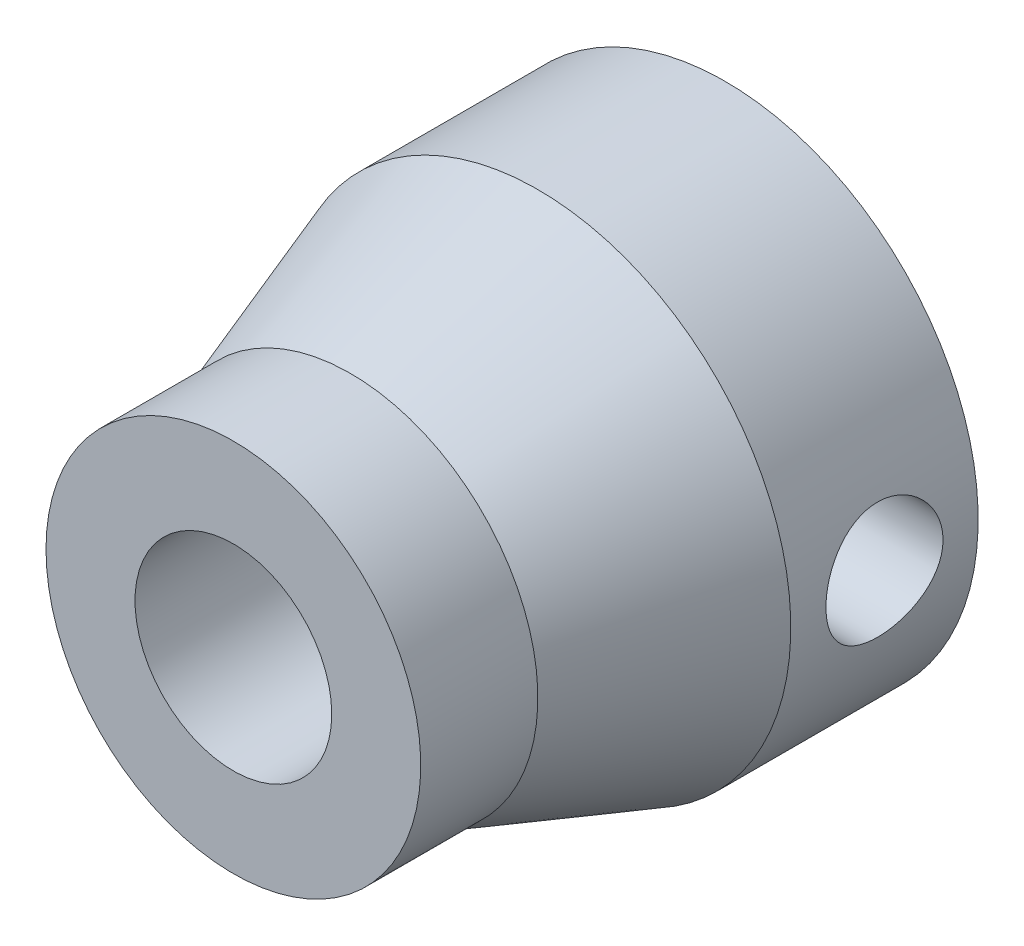
ISO-10303-21;
HEADER;
FILE_DESCRIPTION(('STEP AP214'),'2;1');
FILE_NAME('part.step','',(''),(''),'','','');
FILE_SCHEMA(('AUTOMOTIVE_DESIGN { 1 0 10303 214 1 1 1 1 }'));
ENDSEC;
DATA;
#1=APPLICATION_CONTEXT('core data for automotive mechanical design processes');
#2=APPLICATION_PROTOCOL_DEFINITION('international standard','automotive_design',2000,#1);
#3=PRODUCT_CONTEXT('',#1,'mechanical');
#4=PRODUCT('Part','Part','',(#3));
#5=PRODUCT_RELATED_PRODUCT_CATEGORY('part','',(#4));
#6=PRODUCT_DEFINITION_FORMATION('','',#4);
#7=PRODUCT_DEFINITION_CONTEXT('part definition',#1,'design');
#8=PRODUCT_DEFINITION('design','',#6,#7);
#9=PRODUCT_DEFINITION_SHAPE('','',#8);
#10=(LENGTH_UNIT() NAMED_UNIT(*) SI_UNIT(.MILLI.,.METRE.));
#11=(NAMED_UNIT(*) PLANE_ANGLE_UNIT() SI_UNIT($,.RADIAN.));
#12=(NAMED_UNIT(*) SI_UNIT($,.STERADIAN.) SOLID_ANGLE_UNIT());
#13=UNCERTAINTY_MEASURE_WITH_UNIT(LENGTH_MEASURE(1.E-05),#10,'distance_accuracy_value','');
#14=(GEOMETRIC_REPRESENTATION_CONTEXT(3) GLOBAL_UNCERTAINTY_ASSIGNED_CONTEXT((#13)) GLOBAL_UNIT_ASSIGNED_CONTEXT((#10,
#11,#12)) REPRESENTATION_CONTEXT('',''));
#15=CARTESIAN_POINT('',(0.,0.,0.));
#16=DIRECTION('',(0.,0.,1.));
#17=DIRECTION('',(1.,0.,0.));
#18=AXIS2_PLACEMENT_3D('',#15,#16,#17);
#19=CARTESIAN_POINT('',(0.,0.,0.));
#20=DIRECTION('',(0.,0.,-1.));
#21=DIRECTION('',(-1.,0.,0.));
#22=AXIS2_PLACEMENT_3D('',#19,#20,#21);
#23=CYLINDRICAL_SURFACE('',#22,2.5);
#24=CARTESIAN_POINT('',(2.5,0.,0.750000000000001));
#25=CARTESIAN_POINT('',(2.49999641755189,-0.065714953691233,0.750004127899377));
#26=CARTESIAN_POINT('',(2.49738113774397,-0.13150824962254,0.755212591402095));
#27=CARTESIAN_POINT('',(2.48717695046745,-0.261150294085531,0.775816100426148));
#28=CARTESIAN_POINT('',(2.47957859786229,-0.324995108391879,0.791230491247063));
#29=CARTESIAN_POINT('',(2.4602034925414,-0.448666931100717,0.831492260770994));
#30=CARTESIAN_POINT('',(2.448442989719,-0.508508503673974,0.856302980310016));
#31=CARTESIAN_POINT('',(2.42182220644723,-0.623090771008206,0.914463276706177));
#32=CARTESIAN_POINT('',(2.40696217041913,-0.677831867487562,0.947812180311066));
#33=CARTESIAN_POINT('',(2.37445322822571,-0.784384772202398,1.02439656185662));
#34=CARTESIAN_POINT('',(2.3566899890942,-0.835819013902639,1.06810809904955));
#35=CARTESIAN_POINT('',(2.32074962808431,-0.930974306083721,1.16315184905879));
#36=CARTESIAN_POINT('',(2.30257220261294,-0.974689478883457,1.21448981471555));
#37=CARTESIAN_POINT('',(2.26623688996684,-1.05656500056285,1.32810418690423));
#38=CARTESIAN_POINT('',(2.24818983712665,-1.09403166943955,1.39092012293239));
#39=CARTESIAN_POINT('',(2.21607473465401,-1.15771028361337,1.52295916998277));
#40=CARTESIAN_POINT('',(2.20200384508737,-1.18393026870792,1.59217766090344));
#41=CARTESIAN_POINT('',(2.18072333797261,-1.22266555273573,1.7308313817774));
#42=CARTESIAN_POINT('',(2.17315339479642,-1.23590732135055,1.80000556508424));
#43=CARTESIAN_POINT('',(2.1647736243566,-1.25053374163606,1.93997354722435));
#44=CARTESIAN_POINT('',(2.1639571167911,-1.25193011046634,2.01076567608894));
#45=CARTESIAN_POINT('',(2.16888662821561,-1.24335910896537,2.14285753039421));
#46=CARTESIAN_POINT('',(2.17385954577517,-1.23473069942103,2.20428003902881));
#47=CARTESIAN_POINT('',(2.18845285917313,-1.20867481132116,2.3246523867163));
#48=CARTESIAN_POINT('',(2.1980747353972,-1.19124452987206,2.38360143163164));
#49=CARTESIAN_POINT('',(2.22109345515926,-1.1477622254825,2.49903641570707));
#50=CARTESIAN_POINT('',(2.23457300829998,-1.12151883389499,2.55543299848224));
#51=CARTESIAN_POINT('',(2.26379255351755,-1.061302109585,2.66329286573751));
#52=CARTESIAN_POINT('',(2.27953355975238,-1.02732530476558,2.71475391950011));
#53=CARTESIAN_POINT('',(2.31391447379107,-0.947582568640985,2.81815156592903));
#54=CARTESIAN_POINT('',(2.33266887795933,-0.900868072961601,2.8693210919702));
#55=CARTESIAN_POINT('',(2.36934529125509,-0.799444473426716,2.96341927323863));
#56=CARTESIAN_POINT('',(2.38726689948501,-0.744731570717856,3.00634399004235));
#57=CARTESIAN_POINT('',(2.42127484103705,-0.62564563228981,3.08460707628716));
#58=CARTESIAN_POINT('',(2.43723730202509,-0.56094198949926,3.11950059055717));
#59=CARTESIAN_POINT('',(2.46447351401553,-0.425582769360996,3.17762128630376));
#60=CARTESIAN_POINT('',(2.47575098679441,-0.354931970331595,3.20085773126896));
#61=CARTESIAN_POINT('',(2.49155417176795,-0.215958114575877,3.23309425464584));
#62=CARTESIAN_POINT('',(2.4965617287664,-0.147926913185405,3.24311404468347));
#63=CARTESIAN_POINT('',(2.50091266823877,-0.0109744999366918,3.25183091391811));
#64=CARTESIAN_POINT('',(2.5002587340164,0.0579462748373768,3.25053335704935));
#65=CARTESIAN_POINT('',(2.49363990316801,0.189041214982492,3.23724163947656));
#66=CARTESIAN_POINT('',(2.48809057110237,0.251324260062443,3.22608433408746));
#67=CARTESIAN_POINT('',(2.47277714143524,0.373008615377396,3.19470241013114));
#68=CARTESIAN_POINT('',(2.46301257917916,0.432409607113746,3.1744767919333));
#69=CARTESIAN_POINT('',(2.43980314267087,0.548610760562081,3.12500191695853));
#70=CARTESIAN_POINT('',(2.42626102212424,0.605287996257691,3.09551118735398));
#71=CARTESIAN_POINT('',(2.39679967896386,0.71307670212365,3.02861558044245));
#72=CARTESIAN_POINT('',(2.38087944457231,0.764185787219102,2.99120733175821));
#73=CARTESIAN_POINT('',(2.34635276671831,0.864709611613316,2.90529946833391));
#74=CARTESIAN_POINT('',(2.32763606060552,0.913465097280798,2.85607141443304));
#75=CARTESIAN_POINT('',(2.29077989504843,1.00232040139155,2.75009356091337));
#76=CARTESIAN_POINT('',(2.27264084226908,1.04241423211355,2.69333860147953));
#77=CARTESIAN_POINT('',(2.23813990282585,1.11463489312212,2.57044543224961));
#78=CARTESIAN_POINT('',(2.2219066207934,1.1462818698483,2.50398591723926));
#79=CARTESIAN_POINT('',(2.19467590460158,1.19760353251725,2.36561241538435));
#80=CARTESIAN_POINT('',(2.18367172800773,1.21729364485946,2.29370559187352));
#81=CARTESIAN_POINT('',(2.16951876260834,1.2423271093121,2.15386222142319));
#82=CARTESIAN_POINT('',(2.16571729325614,1.24886624550108,2.0862071832137));
#83=CARTESIAN_POINT('',(2.16456693307719,1.25086144297598,1.95069116603659));
#84=CARTESIAN_POINT('',(2.16721524534441,1.2463223082805,1.88283028907571));
#85=CARTESIAN_POINT('',(2.17797327562531,1.22740765699033,1.75564562308498));
#86=CARTESIAN_POINT('',(2.18553868102992,1.2140103929285,1.6961244123195));
#87=CARTESIAN_POINT('',(2.20463770234897,1.17896919778081,1.58023985071912));
#88=CARTESIAN_POINT('',(2.21617259462095,1.15732261394976,1.52387752238504));
#89=CARTESIAN_POINT('',(2.2428566295566,1.10476968162585,1.41171893626674));
#90=CARTESIAN_POINT('',(2.25819652995238,1.07333892227057,1.35621512271287));
#91=CARTESIAN_POINT('',(2.29044164543238,1.00268871454579,1.25090682977427));
#92=CARTESIAN_POINT('',(2.30734767243153,0.963465214048309,1.20110533685189));
#93=CARTESIAN_POINT('',(2.34327903949141,0.8727541583308,1.10232252205298));
#94=CARTESIAN_POINT('',(2.36231229139336,0.820355528762713,1.0541761220476));
#95=CARTESIAN_POINT('',(2.3984719031886,0.707693507775348,0.96717127072046));
#96=CARTESIAN_POINT('',(2.4155972326005,0.64742590407098,0.928317825717139));
#97=CARTESIAN_POINT('',(2.44622511981379,0.519914496024932,0.860954546547245));
#98=CARTESIAN_POINT('',(2.45970120703636,0.452624379918267,0.832519788235707));
#99=CARTESIAN_POINT('',(2.48126676704332,0.313427626617738,0.787739790101311));
#100=CARTESIAN_POINT('',(2.48937154216165,0.241534749528956,0.771360191463029));
#101=CARTESIAN_POINT('',(2.49619327387079,0.140752433104229,0.757628236155189));
#102=CARTESIAN_POINT('',(2.49761706674002,0.112702349299373,0.754771698920477));
#103=CARTESIAN_POINT('',(2.49952121222331,0.0564396647589471,0.750956668103994));
#104=CARTESIAN_POINT('',(2.50000153879704,0.0282270595592268,0.749998226911001));
#105=CARTESIAN_POINT('',(2.5,0.,0.750000000000001));
#106=B_SPLINE_CURVE_WITH_KNOTS('',3,(#24,#25,#26,#27,#28,#29,#30,#31,#32,#33,#34,#35,#36,#37,
#38,#39,#40,#41,#42,#43,#44,#45,#46,#47,#48,#49,#50,#51,#52,#53,#54,#55,#56,#57,#58,#59,#60,#61,
#62,#63,#64,#65,#66,#67,#68,#69,#70,#71,#72,#73,#74,#75,#76,#77,#78,#79,#80,#81,#82,#83,#84,#85,
#86,#87,#88,#89,#90,#91,#92,#93,#94,#95,#96,#97,#98,#99,#100,#101,#102,#103,#104,#105),
.UNSPECIFIED.,.T.,.F.,(4,2,2,2,2,2,2,2,2,2,2,2,2,2,2,2,2,2,2,2,2,2,2,2,2,2,2,2,2,2,2,2,2,2,2,2,
2,2,2,2,4),(0.,0.197030321775365,0.394435187136497,0.591077694365372,0.787704700726959,
0.99622719839761,1.20490779706754,1.42977158038441,1.65447434872851,1.86572515175287,
2.07676696661275,2.26257140511651,2.44843504907098,2.63862800210609,2.82890651575277,
3.04331176667348,3.25781918248358,3.4822877776805,3.70657771140349,3.91229113089182,
4.11790705639345,4.30758633132652,4.49728652038664,4.69241070034873,4.88761813435423,
5.10199513305523,5.31651985769289,5.54143352699592,5.76605639925971,5.96911634372966,
6.17208824825006,6.35572412805228,6.53941910979597,6.73545570969517,6.93159451423696,
7.15156553440622,7.37165479220715,7.59330017078656,7.81431135781162,7.89894100172121,
7.98357298143558),.UNSPECIFIED.);
#107=CARTESIAN_POINT('',(2.5,0.,0.750000000000001));
#108=VERTEX_POINT('',#107);
#109=EDGE_CURVE('E74',#108,#108,#106,.T.);
#110=ORIENTED_EDGE('',*,*,#109,.F.);
#111=EDGE_LOOP('',(#110));
#112=FACE_BOUND('',#111,.T.);
#113=CARTESIAN_POINT('',(0.,0.,0.));
#114=DIRECTION('',(0.,0.,-1.));
#115=DIRECTION('',(-1.,0.,0.));
#116=AXIS2_PLACEMENT_3D('',#113,#114,#115);
#117=CIRCLE('',#116,2.5);
#118=CARTESIAN_POINT('',(-2.5,0.,0.));
#119=VERTEX_POINT('',#118);
#120=EDGE_CURVE('E57',#119,#119,#117,.T.);
#121=ORIENTED_EDGE('',*,*,#120,.T.);
#122=EDGE_LOOP('',(#121));
#123=FACE_BOUND('',#122,.T.);
#124=CARTESIAN_POINT('',(0.,0.,5.));
#125=DIRECTION('',(0.,0.,-1.));
#126=DIRECTION('',(-1.,0.,0.));
#127=AXIS2_PLACEMENT_3D('',#124,#125,#126);
#128=CIRCLE('',#127,2.5);
#129=CARTESIAN_POINT('',(-2.5,0.,5.));
#130=VERTEX_POINT('',#129);
#131=EDGE_CURVE('E10',#130,#130,#128,.T.);
#132=ORIENTED_EDGE('',*,*,#131,.F.);
#133=EDGE_LOOP('',(#132));
#134=FACE_BOUND('',#133,.T.);
#135=ADVANCED_FACE('F35',(#112,#123,#134),#23,.F.);
#136=CARTESIAN_POINT('',(-1.,0.,5.));
#137=DIRECTION('',(0.,0.,-1.));
#138=DIRECTION('',(-1.,0.,0.));
#139=AXIS2_PLACEMENT_3D('',#136,#137,#138);
#140=PLANE('',#139);
#141=CARTESIAN_POINT('',(0.,0.,5.));
#142=DIRECTION('',(0.,0.,-1.));
#143=DIRECTION('',(-1.,0.,0.));
#144=AXIS2_PLACEMENT_3D('',#141,#142,#143);
#145=CIRCLE('',#144,2.09999999999999);
#146=CARTESIAN_POINT('',(-2.09999999999999,0.,5.));
#147=VERTEX_POINT('',#146);
#148=EDGE_CURVE('E60',#147,#147,#145,.T.);
#149=ORIENTED_EDGE('',*,*,#148,.F.);
#150=EDGE_LOOP('',(#149));
#151=FACE_BOUND('',#150,.T.);
#152=ORIENTED_EDGE('',*,*,#131,.T.);
#153=EDGE_LOOP('',(#152));
#154=FACE_BOUND('',#153,.T.);
#155=ADVANCED_FACE('F103',(#151,#154),#140,.T.);
#156=CARTESIAN_POINT('',(-1.,0.,10.5));
#157=DIRECTION('',(0.,0.,1.));
#158=DIRECTION('',(1.,0.,0.));
#159=AXIS2_PLACEMENT_3D('',#156,#157,#158);
#160=PLANE('',#159);
#161=CARTESIAN_POINT('',(0.,0.,10.5));
#162=DIRECTION('',(0.,0.,1.));
#163=DIRECTION('',(1.,0.,0.));
#164=AXIS2_PLACEMENT_3D('',#161,#162,#163);
#165=CIRCLE('',#164,2.09999999999999);
#166=CARTESIAN_POINT('',(2.09999999999999,0.,10.5));
#167=VERTEX_POINT('',#166);
#168=EDGE_CURVE('E63',#167,#167,#165,.T.);
#169=ORIENTED_EDGE('',*,*,#168,.F.);
#170=EDGE_LOOP('',(#169));
#171=FACE_BOUND('',#170,.T.);
#172=CARTESIAN_POINT('',(0.,0.,10.5));
#173=DIRECTION('',(0.,0.,-1.));
#174=DIRECTION('',(-1.,0.,0.));
#175=AXIS2_PLACEMENT_3D('',#172,#173,#174);
#176=CIRCLE('',#175,4.);
#177=CARTESIAN_POINT('',(-4.,0.,10.5));
#178=VERTEX_POINT('',#177);
#179=EDGE_CURVE('E41',#178,#178,#176,.T.);
#180=ORIENTED_EDGE('',*,*,#179,.F.);
#181=EDGE_LOOP('',(#180));
#182=FACE_BOUND('',#181,.T.);
#183=ADVANCED_FACE('F108',(#171,#182),#160,.T.);
#184=CARTESIAN_POINT('',(0.,0.,0.));
#185=DIRECTION('',(0.,0.,-1.));
#186=DIRECTION('',(-1.,0.,0.));
#187=AXIS2_PLACEMENT_3D('',#184,#185,#186);
#188=CYLINDRICAL_SURFACE('',#187,4.);
#189=ORIENTED_EDGE('',*,*,#179,.T.);
#190=EDGE_LOOP('',(#189));
#191=FACE_BOUND('',#190,.T.);
#192=CARTESIAN_POINT('',(0.,0.,8.));
#193=DIRECTION('',(0.,0.,-1.));
#194=DIRECTION('',(-1.,0.,0.));
#195=AXIS2_PLACEMENT_3D('',#192,#193,#194);
#196=CIRCLE('',#195,4.);
#197=CARTESIAN_POINT('',(-4.,0.,8.));
#198=VERTEX_POINT('',#197);
#199=EDGE_CURVE('E45',#198,#198,#196,.T.);
#200=ORIENTED_EDGE('',*,*,#199,.F.);
#201=EDGE_LOOP('',(#200));
#202=FACE_BOUND('',#201,.T.);
#203=ADVANCED_FACE('F119',(#191,#202),#188,.T.);
#204=CARTESIAN_POINT('',(0.,0.,4.));
#205=DIRECTION('',(0.,0.,-1.));
#206=DIRECTION('',(-1.,0.,0.));
#207=AXIS2_PLACEMENT_3D('',#204,#205,#206);
#208=CONICAL_SURFACE('',#207,5.4,0.336674819386727);
#209=ORIENTED_EDGE('',*,*,#199,.T.);
#210=EDGE_LOOP('',(#209));
#211=FACE_BOUND('',#210,.T.);
#212=CARTESIAN_POINT('',(0.,0.,4.));
#213=DIRECTION('',(0.,0.,-1.));
#214=DIRECTION('',(-1.,0.,0.));
#215=AXIS2_PLACEMENT_3D('',#212,#213,#214);
#216=CIRCLE('',#215,5.4);
#217=CARTESIAN_POINT('',(-5.4,0.,4.));
#218=VERTEX_POINT('',#217);
#219=EDGE_CURVE('E49',#218,#218,#216,.T.);
#220=ORIENTED_EDGE('',*,*,#219,.F.);
#221=EDGE_LOOP('',(#220));
#222=FACE_BOUND('',#221,.T.);
#223=ADVANCED_FACE('F99',(#211,#222),#208,.T.);
#224=CARTESIAN_POINT('',(0.,0.,0.));
#225=DIRECTION('',(0.,0.,-1.));
#226=DIRECTION('',(-1.,0.,0.));
#227=AXIS2_PLACEMENT_3D('',#224,#225,#226);
#228=CYLINDRICAL_SURFACE('',#227,5.4);
#229=CARTESIAN_POINT('',(5.4,0.,0.750000000000001));
#230=CARTESIAN_POINT('',(5.39999874823438,0.0692241871145403,0.750002211770963));
#231=CARTESIAN_POINT('',(5.39865546800572,0.138474266427772,0.755769777927965));
#232=CARTESIAN_POINT('',(5.39342675426803,0.275000425366631,0.778659560700592));
#233=CARTESIAN_POINT('',(5.38953965210246,0.342275178961732,0.795789230551391));
#234=CARTESIAN_POINT('',(5.37965516979212,0.472858483968851,0.840832442091347));
#235=CARTESIAN_POINT('',(5.37366012568423,0.536171334869416,0.868734049579805));
#236=CARTESIAN_POINT('',(5.36020341061013,0.657216106152046,0.934489581370946));
#237=CARTESIAN_POINT('',(5.35274174258654,0.714948037731248,0.97234348570552));
#238=CARTESIAN_POINT('',(5.33701743019704,0.824223728513662,1.0576434492428));
#239=CARTESIAN_POINT('',(5.32874387739558,0.875653654684864,1.1052333370637));
#240=CARTESIAN_POINT('',(5.31240337894845,0.969877453577131,1.20834591811521));
#241=CARTESIAN_POINT('',(5.30433645361578,1.01267048005084,1.26386938777234));
#242=CARTESIAN_POINT('',(5.2892141261743,1.08892093571322,1.38213125549625));
#243=CARTESIAN_POINT('',(5.28217265376136,1.12225476741282,1.44495128561076));
#244=CARTESIAN_POINT('',(5.27005610560817,1.17784701650963,1.57549178185647));
#245=CARTESIAN_POINT('',(5.26498076415844,1.20010693058863,1.64321158434705));
#246=CARTESIAN_POINT('',(5.25748265119255,1.23253847327747,1.78038763342959));
#247=CARTESIAN_POINT('',(5.2550154349981,1.24291290618177,1.84979344937481));
#248=CARTESIAN_POINT('',(5.25287961956346,1.25191004217409,1.98940090166641));
#249=CARTESIAN_POINT('',(5.25321063325227,1.25053437061961,2.05960242660308));
#250=CARTESIAN_POINT('',(5.25659375047557,1.23623300176578,2.19728284421562));
#251=CARTESIAN_POINT('',(5.25958979574762,1.22354523877694,2.26478804070032));
#252=CARTESIAN_POINT('',(5.2678764915052,1.18735782432143,2.39668487670125));
#253=CARTESIAN_POINT('',(5.2731672844797,1.16385750145935,2.46107632259772));
#254=CARTESIAN_POINT('',(5.28550107960884,1.10649981926167,2.58557453093805));
#255=CARTESIAN_POINT('',(5.29255911403959,1.07255300269372,2.64563852802482));
#256=CARTESIAN_POINT('',(5.30762320463089,0.995328718186158,2.75930459854825));
#257=CARTESIAN_POINT('',(5.31562940449809,0.952049835034112,2.81290568995769));
#258=CARTESIAN_POINT('',(5.33192650722274,0.856141032424575,2.9134918693618));
#259=CARTESIAN_POINT('',(5.34021959983535,0.803309372870152,2.96028445401572));
#260=CARTESIAN_POINT('',(5.35597952063802,0.690452447512654,3.04437901499062));
#261=CARTESIAN_POINT('',(5.36344633016309,0.630427019272688,3.08168077694731));
#262=CARTESIAN_POINT('',(5.37674137922928,0.504635960206347,3.14579134647603));
#263=CARTESIAN_POINT('',(5.38256529931455,0.438855782479791,3.17257256478928));
#264=CARTESIAN_POINT('',(5.39188660170977,0.30356339515595,3.21464627002836));
#265=CARTESIAN_POINT('',(5.39538436395879,0.234051797029329,3.22994063319308));
#266=CARTESIAN_POINT('',(5.39960432194415,0.0949188474226058,3.24832100682319));
#267=CARTESIAN_POINT('',(5.40038621683971,0.0253339536305773,3.25166964888367));
#268=CARTESIAN_POINT('',(5.39925471054082,-0.113401199396407,3.24677870165908));
#269=CARTESIAN_POINT('',(5.39734151538226,-0.182551491450131,3.23853999821056));
#270=CARTESIAN_POINT('',(5.39107270805315,-0.317567653128891,3.21092556690345));
#271=CARTESIAN_POINT('',(5.38674779900457,-0.383463694391253,3.19168976509555));
#272=CARTESIAN_POINT('',(5.37614070405043,-0.511092660604726,3.14278425017143));
#273=CARTESIAN_POINT('',(5.3698583382899,-0.572825202371076,3.11311357824669));
#274=CARTESIAN_POINT('',(5.35588743525236,-0.691444779334462,3.04364847732382));
#275=CARTESIAN_POINT('',(5.34817839030347,-0.748240639647342,3.00370257610649));
#276=CARTESIAN_POINT('',(5.33224710804932,-0.854416896018498,2.91501804549652));
#277=CARTESIAN_POINT('',(5.32402479563046,-0.903796203090457,2.86627812717025));
#278=CARTESIAN_POINT('',(5.30778399091491,-0.994793544081783,2.76017783658924));
#279=CARTESIAN_POINT('',(5.29977329933032,-1.0362287089936,2.70265919800381));
#280=CARTESIAN_POINT('',(5.28505640511214,-1.10885407052095,2.58132673225702));
#281=CARTESIAN_POINT('',(5.27835014441881,-1.14004472315851,2.51751318547033));
#282=CARTESIAN_POINT('',(5.26706995749014,-1.19107407331668,2.38575053162684));
#283=CARTESIAN_POINT('',(5.2624836492151,-1.21097884732069,2.31782812839382));
#284=CARTESIAN_POINT('',(5.2559438279697,-1.23905858603521,2.17948120782013));
#285=CARTESIAN_POINT('',(5.25398983488665,-1.24723568979417,2.10905714916654));
#286=CARTESIAN_POINT('',(5.25296867632895,-1.2515285845306,1.96955615019909));
#287=CARTESIAN_POINT('',(5.25383190937952,-1.24793516606778,1.9004885130342));
#288=CARTESIAN_POINT('',(5.25818914739366,-1.22944516739717,1.76397209528447));
#289=CARTESIAN_POINT('',(5.26168311330701,-1.21454875496928,1.69652329068526));
#290=CARTESIAN_POINT('',(5.27087224339566,-1.17402355997323,1.56542361089538));
#291=CARTESIAN_POINT('',(5.27655773123556,-1.14844191549021,1.50175744065481));
#292=CARTESIAN_POINT('',(5.28949203841655,-1.08731126166201,1.37957919121915));
#293=CARTESIAN_POINT('',(5.2967410425912,-1.05176107372034,1.32106772254817));
#294=CARTESIAN_POINT('',(5.31218981239259,-0.970758826498259,1.20943725861768));
#295=CARTESIAN_POINT('',(5.32040732565605,-0.92510163582206,1.15646954095245));
#296=CARTESIAN_POINT('',(5.33675342745657,-0.825590992830997,1.05885252724268));
#297=CARTESIAN_POINT('',(5.34488199482159,-0.771735632696653,1.01420517284684));
#298=CARTESIAN_POINT('',(5.36027855985255,-0.656388355565246,0.933853560611235));
#299=CARTESIAN_POINT('',(5.36753191208641,-0.594794510125286,0.898292637731052));
#300=CARTESIAN_POINT('',(5.38021121124879,-0.466345339684815,0.838085876748606));
#301=CARTESIAN_POINT('',(5.3856386038694,-0.399494229079049,0.813431398643538));
#302=CARTESIAN_POINT('',(5.39315038381651,-0.277203903682884,0.779846767779616));
#303=CARTESIAN_POINT('',(5.39570241420179,-0.222397521091905,0.768676664335558));
#304=CARTESIAN_POINT('',(5.3991276811903,-0.111733009859767,0.753752592309421));
#305=CARTESIAN_POINT('',(5.40000101037414,-0.0558749393909186,0.749998214748724));
#306=CARTESIAN_POINT('',(5.4,0.,0.750000000000001));
#307=B_SPLINE_CURVE_WITH_KNOTS('',3,(#229,#230,#231,#232,#233,#234,#235,#236,#237,#238,#239,
#240,#241,#242,#243,#244,#245,#246,#247,#248,#249,#250,#251,#252,#253,#254,#255,#256,#257,#258,
#259,#260,#261,#262,#263,#264,#265,#266,#267,#268,#269,#270,#271,#272,#273,#274,#275,#276,#277,
#278,#279,#280,#281,#282,#283,#284,#285,#286,#287,#288,#289,#290,#291,#292,#293,#294,#295,#296,
#297,#298,#299,#300,#301,#302,#303,#304,#305,#306),.UNSPECIFIED.,.T.,.F.,(4,2,2,2,2,2,2,2,2,2,2,
2,2,2,2,2,2,2,2,2,2,2,2,2,2,2,2,2,2,2,2,2,2,2,2,2,2,2,4),(0.,0.207467946105603,
0.415072120385802,0.622446947561193,0.829821358666675,1.04051486741415,1.25122900999614,
1.46458145535715,1.67790505749033,1.88753176908611,2.09712948410295,2.30241996008224,
2.50772318509512,2.71483586958108,2.92197998492394,3.1341595790516,3.34634396514453,
3.55908113091197,3.77178354107411,3.97977975138832,4.1877600615439,4.39315114378166,
4.59856110332142,4.80719248561258,5.01585447175303,5.2288581378352,5.44185232103247,
5.65358623747827,5.86528153016325,6.07178671705002,6.27828883866533,6.48388943660925,
6.68951435329084,6.89977416821969,7.11008298832518,7.32352890318486,7.53680542367441,
7.70427432097337,7.87173398207459),.UNSPECIFIED.);
#308=CARTESIAN_POINT('',(5.4,0.,0.750000000000001));
#309=VERTEX_POINT('',#308);
#310=EDGE_CURVE('E66',#309,#309,#307,.T.);
#311=ORIENTED_EDGE('',*,*,#310,.F.);
#312=EDGE_LOOP('',(#311));
#313=FACE_BOUND('',#312,.T.);
#314=ORIENTED_EDGE('',*,*,#219,.T.);
#315=EDGE_LOOP('',(#314));
#316=FACE_BOUND('',#315,.T.);
#317=CARTESIAN_POINT('',(0.,0.,0.));
#318=DIRECTION('',(0.,0.,-1.));
#319=DIRECTION('',(-1.,0.,0.));
#320=AXIS2_PLACEMENT_3D('',#317,#318,#319);
#321=CIRCLE('',#320,5.4);
#322=CARTESIAN_POINT('',(-5.4,0.,0.));
#323=VERTEX_POINT('',#322);
#324=EDGE_CURVE('E54',#323,#323,#321,.T.);
#325=ORIENTED_EDGE('',*,*,#324,.F.);
#326=EDGE_LOOP('',(#325));
#327=FACE_BOUND('',#326,.T.);
#328=ADVANCED_FACE('F79',(#313,#316,#327),#228,.T.);
#329=CARTESIAN_POINT('',(-5.4,0.,0.));
#330=DIRECTION('',(0.,0.,-1.));
#331=DIRECTION('',(-1.,0.,0.));
#332=AXIS2_PLACEMENT_3D('',#329,#330,#331);
#333=PLANE('',#332);
#334=ORIENTED_EDGE('',*,*,#324,.T.);
#335=EDGE_LOOP('',(#334));
#336=FACE_BOUND('',#335,.T.);
#337=ORIENTED_EDGE('',*,*,#120,.F.);
#338=EDGE_LOOP('',(#337));
#339=FACE_BOUND('',#338,.T.);
#340=ADVANCED_FACE('F92',(#336,#339),#333,.T.);
#341=CARTESIAN_POINT('',(0.,0.,10.5));
#342=DIRECTION('',(0.,0.,1.));
#343=DIRECTION('',(1.,0.,0.));
#344=AXIS2_PLACEMENT_3D('',#341,#342,#343);
#345=CYLINDRICAL_SURFACE('',#344,2.09999999999999);
#346=ORIENTED_EDGE('',*,*,#148,.T.);
#347=EDGE_LOOP('',(#346));
#348=FACE_BOUND('',#347,.T.);
#349=ORIENTED_EDGE('',*,*,#168,.T.);
#350=EDGE_LOOP('',(#349));
#351=FACE_BOUND('',#350,.T.);
#352=ADVANCED_FACE('F86',(#348,#351),#345,.F.);
#353=CARTESIAN_POINT('',(5.4,0.,2.));
#354=DIRECTION('',(1.,0.,0.));
#355=DIRECTION('',(0.,0.,-1.));
#356=AXIS2_PLACEMENT_3D('',#353,#354,#355);
#357=CYLINDRICAL_SURFACE('',#356,1.25);
#358=ORIENTED_EDGE('',*,*,#310,.T.);
#359=EDGE_LOOP('',(#358));
#360=FACE_BOUND('',#359,.T.);
#361=ORIENTED_EDGE('',*,*,#109,.T.);
#362=EDGE_LOOP('',(#361));
#363=FACE_BOUND('',#362,.T.);
#364=ADVANCED_FACE('F83',(#360,#363),#357,.F.);
#365=CLOSED_SHELL('',(#135,#155,#183,#203,#223,#328,#340,#352,#364));
#366=MANIFOLD_SOLID_BREP('B2',#365);
#367=ADVANCED_BREP_SHAPE_REPRESENTATION('',(#18,#366),#14);
#368=SHAPE_DEFINITION_REPRESENTATION(#9,#367);
ENDSEC;
END-ISO-10303-21;
